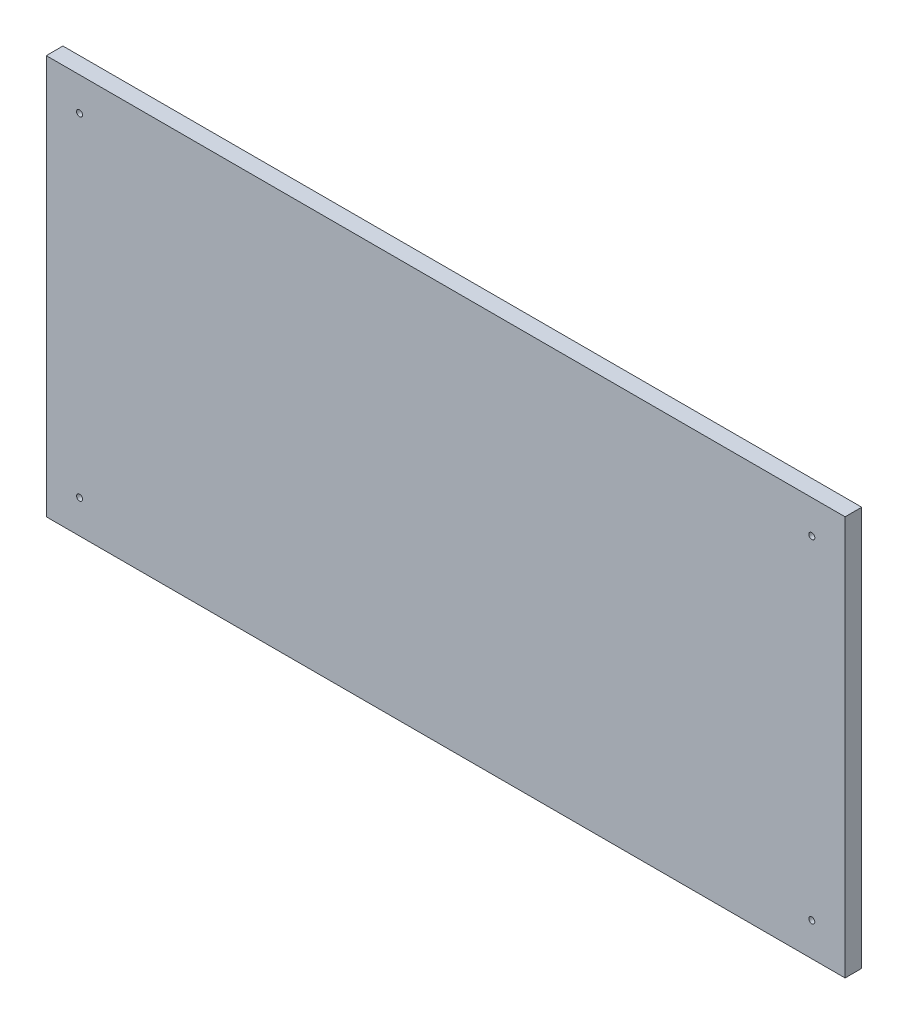
ISO-10303-21;
HEADER;
FILE_DESCRIPTION(('STEP AP214'),'2;1');
FILE_NAME('part.step','',(''),(''),'','','');
FILE_SCHEMA(('AUTOMOTIVE_DESIGN { 1 0 10303 214 1 1 1 1 }'));
ENDSEC;
DATA;
#1=APPLICATION_CONTEXT('core data for automotive mechanical design processes');
#2=APPLICATION_PROTOCOL_DEFINITION('international standard','automotive_design',2000,#1);
#3=PRODUCT_CONTEXT('',#1,'mechanical');
#4=PRODUCT('Part','Part','',(#3));
#5=PRODUCT_RELATED_PRODUCT_CATEGORY('part','',(#4));
#6=PRODUCT_DEFINITION_FORMATION('','',#4);
#7=PRODUCT_DEFINITION_CONTEXT('part definition',#1,'design');
#8=PRODUCT_DEFINITION('design','',#6,#7);
#9=PRODUCT_DEFINITION_SHAPE('','',#8);
#10=(LENGTH_UNIT() NAMED_UNIT(*) SI_UNIT(.MILLI.,.METRE.));
#11=(NAMED_UNIT(*) PLANE_ANGLE_UNIT() SI_UNIT($,.RADIAN.));
#12=(NAMED_UNIT(*) SI_UNIT($,.STERADIAN.) SOLID_ANGLE_UNIT());
#13=UNCERTAINTY_MEASURE_WITH_UNIT(LENGTH_MEASURE(1.E-05),#10,'distance_accuracy_value','');
#14=(GEOMETRIC_REPRESENTATION_CONTEXT(3) GLOBAL_UNCERTAINTY_ASSIGNED_CONTEXT((#13)) GLOBAL_UNIT_ASSIGNED_CONTEXT((#10,
#11,#12)) REPRESENTATION_CONTEXT('',''));
#15=CARTESIAN_POINT('',(0.,0.,0.));
#16=DIRECTION('',(0.,0.,1.));
#17=DIRECTION('',(1.,0.,0.));
#18=AXIS2_PLACEMENT_3D('',#15,#16,#17);
#19=CARTESIAN_POINT('',(600.,-300.,25.));
#20=DIRECTION('',(-1.,0.,0.));
#21=DIRECTION('',(0.,0.,1.));
#22=AXIS2_PLACEMENT_3D('',#19,#20,#21);
#23=PLANE('',#22);
#24=DIRECTION('',(0.,1.,0.));
#25=VECTOR('',#24,1.);
#26=CARTESIAN_POINT('',(600.,-300.,0.));
#27=LINE('',#26,#25);
#28=CARTESIAN_POINT('',(600.,-300.,0.));
#29=VERTEX_POINT('',#28);
#30=CARTESIAN_POINT('',(600.,300.,0.));
#31=VERTEX_POINT('',#30);
#32=EDGE_CURVE('E105',#29,#31,#27,.T.);
#33=ORIENTED_EDGE('',*,*,#32,.T.);
#34=DIRECTION('',(0.,0.,-1.));
#35=VECTOR('',#34,1.);
#36=CARTESIAN_POINT('',(600.,300.,25.));
#37=LINE('',#36,#35);
#38=CARTESIAN_POINT('',(600.,300.,25.));
#39=VERTEX_POINT('',#38);
#40=EDGE_CURVE('E11',#39,#31,#37,.T.);
#41=ORIENTED_EDGE('',*,*,#40,.F.);
#42=DIRECTION('',(0.,1.,0.));
#43=VECTOR('',#42,1.);
#44=CARTESIAN_POINT('',(600.,-300.,25.));
#45=LINE('',#44,#43);
#46=CARTESIAN_POINT('',(600.,-300.,25.));
#47=VERTEX_POINT('',#46);
#48=EDGE_CURVE('E89',#47,#39,#45,.T.);
#49=ORIENTED_EDGE('',*,*,#48,.F.);
#50=DIRECTION('',(0.,0.,-1.));
#51=VECTOR('',#50,1.);
#52=CARTESIAN_POINT('',(600.,-300.,25.));
#53=LINE('',#52,#51);
#54=EDGE_CURVE('E98',#47,#29,#53,.T.);
#55=ORIENTED_EDGE('',*,*,#54,.T.);
#56=EDGE_LOOP('',(#33,#41,#49,#55));
#57=FACE_BOUND('',#56,.T.);
#58=ADVANCED_FACE('F39',(#57),#23,.F.);
#59=CARTESIAN_POINT('',(-600.,300.,25.));
#60=DIRECTION('',(0.,-1.,0.));
#61=DIRECTION('',(0.,0.,-1.));
#62=AXIS2_PLACEMENT_3D('',#59,#60,#61);
#63=PLANE('',#62);
#64=DIRECTION('',(-1.,0.,0.));
#65=VECTOR('',#64,1.);
#66=CARTESIAN_POINT('',(-600.,300.,0.));
#67=LINE('',#66,#65);
#68=CARTESIAN_POINT('',(-600.,300.,0.));
#69=VERTEX_POINT('',#68);
#70=EDGE_CURVE('E94',#31,#69,#67,.T.);
#71=ORIENTED_EDGE('',*,*,#70,.T.);
#72=DIRECTION('',(0.,0.,-1.));
#73=VECTOR('',#72,1.);
#74=CARTESIAN_POINT('',(-600.,300.,25.));
#75=LINE('',#74,#73);
#76=CARTESIAN_POINT('',(-600.,300.,25.));
#77=VERTEX_POINT('',#76);
#78=EDGE_CURVE('E50',#77,#69,#75,.T.);
#79=ORIENTED_EDGE('',*,*,#78,.F.);
#80=DIRECTION('',(-1.,0.,0.));
#81=VECTOR('',#80,1.);
#82=CARTESIAN_POINT('',(-600.,300.,25.));
#83=LINE('',#82,#81);
#84=EDGE_CURVE('E81',#39,#77,#83,.T.);
#85=ORIENTED_EDGE('',*,*,#84,.F.);
#86=ORIENTED_EDGE('',*,*,#40,.T.);
#87=EDGE_LOOP('',(#71,#79,#85,#86));
#88=FACE_BOUND('',#87,.T.);
#89=ADVANCED_FACE('F91',(#88),#63,.F.);
#90=CARTESIAN_POINT('',(-600.,-300.,25.));
#91=DIRECTION('',(1.,0.,0.));
#92=DIRECTION('',(0.,0.,-1.));
#93=AXIS2_PLACEMENT_3D('',#90,#91,#92);
#94=PLANE('',#93);
#95=DIRECTION('',(0.,-1.,0.));
#96=VECTOR('',#95,1.);
#97=CARTESIAN_POINT('',(-600.,-300.,0.));
#98=LINE('',#97,#96);
#99=CARTESIAN_POINT('',(-600.,-300.,0.));
#100=VERTEX_POINT('',#99);
#101=EDGE_CURVE('E75',#69,#100,#98,.T.);
#102=ORIENTED_EDGE('',*,*,#101,.T.);
#103=DIRECTION('',(0.,0.,-1.));
#104=VECTOR('',#103,1.);
#105=CARTESIAN_POINT('',(-600.,-300.,25.));
#106=LINE('',#105,#104);
#107=CARTESIAN_POINT('',(-600.,-300.,25.));
#108=VERTEX_POINT('',#107);
#109=EDGE_CURVE('E92',#108,#100,#106,.T.);
#110=ORIENTED_EDGE('',*,*,#109,.F.);
#111=DIRECTION('',(0.,-1.,0.));
#112=VECTOR('',#111,1.);
#113=CARTESIAN_POINT('',(-600.,-300.,25.));
#114=LINE('',#113,#112);
#115=EDGE_CURVE('E86',#77,#108,#114,.T.);
#116=ORIENTED_EDGE('',*,*,#115,.F.);
#117=ORIENTED_EDGE('',*,*,#78,.T.);
#118=EDGE_LOOP('',(#102,#110,#116,#117));
#119=FACE_BOUND('',#118,.T.);
#120=ADVANCED_FACE('F96',(#119),#94,.F.);
#121=CARTESIAN_POINT('',(-600.,-300.,25.));
#122=DIRECTION('',(0.,1.,0.));
#123=DIRECTION('',(0.,0.,1.));
#124=AXIS2_PLACEMENT_3D('',#121,#122,#123);
#125=PLANE('',#124);
#126=DIRECTION('',(1.,0.,0.));
#127=VECTOR('',#126,1.);
#128=CARTESIAN_POINT('',(-600.,-300.,0.));
#129=LINE('',#128,#127);
#130=EDGE_CURVE('E77',#100,#29,#129,.T.);
#131=ORIENTED_EDGE('',*,*,#130,.T.);
#132=ORIENTED_EDGE('',*,*,#54,.F.);
#133=DIRECTION('',(1.,0.,0.));
#134=VECTOR('',#133,1.);
#135=CARTESIAN_POINT('',(-600.,-300.,25.));
#136=LINE('',#135,#134);
#137=EDGE_CURVE('E54',#108,#47,#136,.T.);
#138=ORIENTED_EDGE('',*,*,#137,.F.);
#139=ORIENTED_EDGE('',*,*,#109,.T.);
#140=EDGE_LOOP('',(#131,#132,#138,#139));
#141=FACE_BOUND('',#140,.T.);
#142=ADVANCED_FACE('F109',(#141),#125,.F.);
#143=CARTESIAN_POINT('',(0.,0.,25.));
#144=DIRECTION('',(0.,0.,-1.));
#145=DIRECTION('',(-1.,0.,0.));
#146=AXIS2_PLACEMENT_3D('',#143,#144,#145);
#147=PLANE('',#146);
#148=CARTESIAN_POINT('',(550.,250.,25.));
#149=DIRECTION('',(0.,0.,-1.));
#150=DIRECTION('',(-1.,0.,0.));
#151=AXIS2_PLACEMENT_3D('',#148,#149,#150);
#152=CIRCLE('',#151,4.49999999999991);
#153=CARTESIAN_POINT('',(545.5,250.,25.));
#154=VERTEX_POINT('',#153);
#155=EDGE_CURVE('E132',#154,#154,#152,.F.);
#156=ORIENTED_EDGE('',*,*,#155,.F.);
#157=EDGE_LOOP('',(#156));
#158=FACE_BOUND('',#157,.T.);
#159=CARTESIAN_POINT('',(-550.,250.,25.));
#160=DIRECTION('',(0.,0.,-1.));
#161=DIRECTION('',(-1.,0.,0.));
#162=AXIS2_PLACEMENT_3D('',#159,#160,#161);
#163=CIRCLE('',#162,4.49999999999991);
#164=CARTESIAN_POINT('',(-554.5,250.,25.));
#165=VERTEX_POINT('',#164);
#166=EDGE_CURVE('E130',#165,#165,#163,.F.);
#167=ORIENTED_EDGE('',*,*,#166,.F.);
#168=EDGE_LOOP('',(#167));
#169=FACE_BOUND('',#168,.T.);
#170=CARTESIAN_POINT('',(550.,-250.,25.));
#171=DIRECTION('',(0.,0.,-1.));
#172=DIRECTION('',(-1.,0.,0.));
#173=AXIS2_PLACEMENT_3D('',#170,#171,#172);
#174=CIRCLE('',#173,4.4999999999999);
#175=CARTESIAN_POINT('',(545.5,-250.,25.));
#176=VERTEX_POINT('',#175);
#177=EDGE_CURVE('E122',#176,#176,#174,.F.);
#178=ORIENTED_EDGE('',*,*,#177,.F.);
#179=EDGE_LOOP('',(#178));
#180=FACE_BOUND('',#179,.T.);
#181=CARTESIAN_POINT('',(-550.,-250.,25.));
#182=DIRECTION('',(0.,0.,-1.));
#183=DIRECTION('',(-1.,0.,0.));
#184=AXIS2_PLACEMENT_3D('',#181,#182,#183);
#185=CIRCLE('',#184,4.4999999999999);
#186=CARTESIAN_POINT('',(-554.5,-250.,25.));
#187=VERTEX_POINT('',#186);
#188=EDGE_CURVE('E104',#187,#187,#185,.F.);
#189=ORIENTED_EDGE('',*,*,#188,.F.);
#190=EDGE_LOOP('',(#189));
#191=FACE_BOUND('',#190,.T.);
#192=ORIENTED_EDGE('',*,*,#48,.T.);
#193=ORIENTED_EDGE('',*,*,#84,.T.);
#194=ORIENTED_EDGE('',*,*,#115,.T.);
#195=ORIENTED_EDGE('',*,*,#137,.T.);
#196=EDGE_LOOP('',(#192,#193,#194,#195));
#197=FACE_BOUND('',#196,.T.);
#198=ADVANCED_FACE('F88',(#158,#169,#180,#191,#197),#147,.F.);
#199=CARTESIAN_POINT('',(0.,0.,0.));
#200=DIRECTION('',(0.,0.,-1.));
#201=DIRECTION('',(-1.,0.,0.));
#202=AXIS2_PLACEMENT_3D('',#199,#200,#201);
#203=PLANE('',#202);
#204=CARTESIAN_POINT('',(550.,250.,0.));
#205=DIRECTION('',(0.,0.,1.));
#206=DIRECTION('',(1.,0.,0.));
#207=AXIS2_PLACEMENT_3D('',#204,#205,#206);
#208=CIRCLE('',#207,4.49999999999991);
#209=CARTESIAN_POINT('',(554.5,250.,0.));
#210=VERTEX_POINT('',#209);
#211=EDGE_CURVE('E137',#210,#210,#208,.T.);
#212=ORIENTED_EDGE('',*,*,#211,.T.);
#213=EDGE_LOOP('',(#212));
#214=FACE_BOUND('',#213,.T.);
#215=CARTESIAN_POINT('',(-550.,250.,0.));
#216=DIRECTION('',(0.,0.,1.));
#217=DIRECTION('',(1.,0.,0.));
#218=AXIS2_PLACEMENT_3D('',#215,#216,#217);
#219=CIRCLE('',#218,4.49999999999991);
#220=CARTESIAN_POINT('',(-545.5,250.,0.));
#221=VERTEX_POINT('',#220);
#222=EDGE_CURVE('E128',#221,#221,#219,.T.);
#223=ORIENTED_EDGE('',*,*,#222,.T.);
#224=EDGE_LOOP('',(#223));
#225=FACE_BOUND('',#224,.T.);
#226=CARTESIAN_POINT('',(550.,-250.,0.));
#227=DIRECTION('',(0.,0.,1.));
#228=DIRECTION('',(1.,0.,0.));
#229=AXIS2_PLACEMENT_3D('',#226,#227,#228);
#230=CIRCLE('',#229,4.4999999999999);
#231=CARTESIAN_POINT('',(554.5,-250.,0.));
#232=VERTEX_POINT('',#231);
#233=EDGE_CURVE('E124',#232,#232,#230,.T.);
#234=ORIENTED_EDGE('',*,*,#233,.T.);
#235=EDGE_LOOP('',(#234));
#236=FACE_BOUND('',#235,.T.);
#237=CARTESIAN_POINT('',(-550.,-250.,0.));
#238=DIRECTION('',(0.,0.,1.));
#239=DIRECTION('',(1.,0.,0.));
#240=AXIS2_PLACEMENT_3D('',#237,#238,#239);
#241=CIRCLE('',#240,4.4999999999999);
#242=CARTESIAN_POINT('',(-545.5,-250.,0.));
#243=VERTEX_POINT('',#242);
#244=EDGE_CURVE('E117',#243,#243,#241,.T.);
#245=ORIENTED_EDGE('',*,*,#244,.T.);
#246=EDGE_LOOP('',(#245));
#247=FACE_BOUND('',#246,.T.);
#248=ORIENTED_EDGE('',*,*,#32,.F.);
#249=ORIENTED_EDGE('',*,*,#130,.F.);
#250=ORIENTED_EDGE('',*,*,#101,.F.);
#251=ORIENTED_EDGE('',*,*,#70,.F.);
#252=EDGE_LOOP('',(#248,#249,#250,#251));
#253=FACE_BOUND('',#252,.T.);
#254=ADVANCED_FACE('F114',(#214,#225,#236,#247,#253),#203,.T.);
#255=CARTESIAN_POINT('',(-550.,-250.,26.));
#256=DIRECTION('',(0.,0.,-1.));
#257=DIRECTION('',(-1.,0.,0.));
#258=AXIS2_PLACEMENT_3D('',#255,#256,#257);
#259=CYLINDRICAL_SURFACE('',#258,4.4999999999999);
#260=ORIENTED_EDGE('',*,*,#244,.F.);
#261=EDGE_LOOP('',(#260));
#262=FACE_BOUND('',#261,.T.);
#263=ORIENTED_EDGE('',*,*,#188,.T.);
#264=EDGE_LOOP('',(#263));
#265=FACE_BOUND('',#264,.T.);
#266=ADVANCED_FACE('F158',(#262,#265),#259,.F.);
#267=CARTESIAN_POINT('',(550.,-250.,26.));
#268=DIRECTION('',(0.,0.,-1.));
#269=DIRECTION('',(-1.,0.,0.));
#270=AXIS2_PLACEMENT_3D('',#267,#268,#269);
#271=CYLINDRICAL_SURFACE('',#270,4.4999999999999);
#272=ORIENTED_EDGE('',*,*,#233,.F.);
#273=EDGE_LOOP('',(#272));
#274=FACE_BOUND('',#273,.T.);
#275=ORIENTED_EDGE('',*,*,#177,.T.);
#276=EDGE_LOOP('',(#275));
#277=FACE_BOUND('',#276,.T.);
#278=ADVANCED_FACE('F159',(#274,#277),#271,.F.);
#279=CARTESIAN_POINT('',(-550.,250.,26.));
#280=DIRECTION('',(0.,0.,-1.));
#281=DIRECTION('',(-1.,0.,0.));
#282=AXIS2_PLACEMENT_3D('',#279,#280,#281);
#283=CYLINDRICAL_SURFACE('',#282,4.49999999999991);
#284=ORIENTED_EDGE('',*,*,#222,.F.);
#285=EDGE_LOOP('',(#284));
#286=FACE_BOUND('',#285,.T.);
#287=ORIENTED_EDGE('',*,*,#166,.T.);
#288=EDGE_LOOP('',(#287));
#289=FACE_BOUND('',#288,.T.);
#290=ADVANCED_FACE('F144',(#286,#289),#283,.F.);
#291=CARTESIAN_POINT('',(550.,250.,26.));
#292=DIRECTION('',(0.,0.,-1.));
#293=DIRECTION('',(-1.,0.,0.));
#294=AXIS2_PLACEMENT_3D('',#291,#292,#293);
#295=CYLINDRICAL_SURFACE('',#294,4.49999999999991);
#296=ORIENTED_EDGE('',*,*,#211,.F.);
#297=EDGE_LOOP('',(#296));
#298=FACE_BOUND('',#297,.T.);
#299=ORIENTED_EDGE('',*,*,#155,.T.);
#300=EDGE_LOOP('',(#299));
#301=FACE_BOUND('',#300,.T.);
#302=ADVANCED_FACE('F142',(#298,#301),#295,.F.);
#303=CLOSED_SHELL('',(#58,#89,#120,#142,#198,#254,#266,#278,#290,#302));
#304=MANIFOLD_SOLID_BREP('B2',#303);
#305=ADVANCED_BREP_SHAPE_REPRESENTATION('',(#18,#304),#14);
#306=SHAPE_DEFINITION_REPRESENTATION(#9,#305);
ENDSEC;
END-ISO-10303-21;
